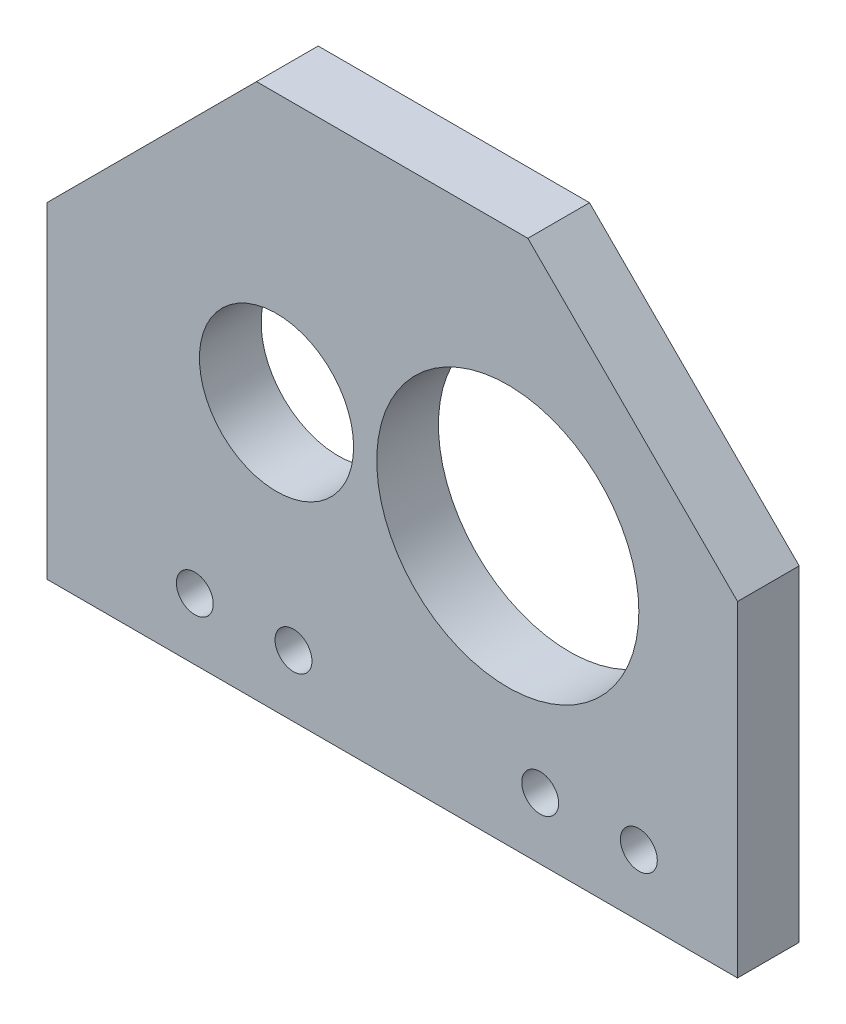
ISO-10303-21;
HEADER;
FILE_DESCRIPTION(('STEP AP214'),'2;1');
FILE_NAME('part.step','',(''),(''),'','','');
FILE_SCHEMA(('AUTOMOTIVE_DESIGN { 1 0 10303 214 1 1 1 1 }'));
ENDSEC;
DATA;
#1=APPLICATION_CONTEXT('core data for automotive mechanical design processes');
#2=APPLICATION_PROTOCOL_DEFINITION('international standard','automotive_design',2000,#1);
#3=PRODUCT_CONTEXT('',#1,'mechanical');
#4=PRODUCT('Part','Part','',(#3));
#5=PRODUCT_RELATED_PRODUCT_CATEGORY('part','',(#4));
#6=PRODUCT_DEFINITION_FORMATION('','',#4);
#7=PRODUCT_DEFINITION_CONTEXT('part definition',#1,'design');
#8=PRODUCT_DEFINITION('design','',#6,#7);
#9=PRODUCT_DEFINITION_SHAPE('','',#8);
#10=(LENGTH_UNIT() NAMED_UNIT(*) SI_UNIT(.MILLI.,.METRE.));
#11=(NAMED_UNIT(*) PLANE_ANGLE_UNIT() SI_UNIT($,.RADIAN.));
#12=(NAMED_UNIT(*) SI_UNIT($,.STERADIAN.) SOLID_ANGLE_UNIT());
#13=UNCERTAINTY_MEASURE_WITH_UNIT(LENGTH_MEASURE(1.E-05),#10,'distance_accuracy_value','');
#14=(GEOMETRIC_REPRESENTATION_CONTEXT(3) GLOBAL_UNCERTAINTY_ASSIGNED_CONTEXT((#13)) GLOBAL_UNIT_ASSIGNED_CONTEXT((#10,
#11,#12)) REPRESENTATION_CONTEXT('',''));
#15=CARTESIAN_POINT('',(0.,0.,0.));
#16=DIRECTION('',(0.,0.,1.));
#17=DIRECTION('',(1.,0.,0.));
#18=AXIS2_PLACEMENT_3D('',#15,#16,#17);
#19=CARTESIAN_POINT('',(0.,0.,6.35));
#20=DIRECTION('',(0.,0.,1.));
#21=DIRECTION('',(1.,0.,0.));
#22=AXIS2_PLACEMENT_3D('',#19,#20,#21);
#23=PLANE('',#22);
#24=DIRECTION('',(0.707106781186548,-0.707106781186548,0.));
#25=VECTOR('',#24,1.);
#26=CARTESIAN_POINT('',(35.56,5.99186000000002,6.35));
#27=LINE('',#26,#25);
#28=CARTESIAN_POINT('',(13.97,27.58186,6.35));
#29=VERTEX_POINT('',#28);
#30=CARTESIAN_POINT('',(35.56,5.99186000000002,6.35));
#31=VERTEX_POINT('',#30);
#32=EDGE_CURVE('E88',#29,#31,#27,.T.);
#33=ORIENTED_EDGE('',*,*,#32,.F.);
#34=DIRECTION('',(-1.,0.,0.));
#35=VECTOR('',#34,1.);
#36=CARTESIAN_POINT('',(35.56,27.58186,6.35));
#37=LINE('',#36,#35);
#38=CARTESIAN_POINT('',(-13.97,27.58186,6.35));
#39=VERTEX_POINT('',#38);
#40=EDGE_CURVE('E56',#29,#39,#37,.T.);
#41=ORIENTED_EDGE('',*,*,#40,.T.);
#42=DIRECTION('',(0.707106781186547,0.707106781186548,0.));
#43=VECTOR('',#42,1.);
#44=CARTESIAN_POINT('',(-35.56,5.99186000000001,6.35));
#45=LINE('',#44,#43);
#46=CARTESIAN_POINT('',(-35.56,5.99186000000001,6.35));
#47=VERTEX_POINT('',#46);
#48=EDGE_CURVE('E93',#47,#39,#45,.T.);
#49=ORIENTED_EDGE('',*,*,#48,.F.);
#50=DIRECTION('',(0.,-1.,0.));
#51=VECTOR('',#50,1.);
#52=CARTESIAN_POINT('',(-35.56,-27.58186,6.35));
#53=LINE('',#52,#51);
#54=CARTESIAN_POINT('',(-35.56,-27.58186,6.35));
#55=VERTEX_POINT('',#54);
#56=EDGE_CURVE('E111',#47,#55,#53,.T.);
#57=ORIENTED_EDGE('',*,*,#56,.T.);
#58=DIRECTION('',(1.,0.,0.));
#59=VECTOR('',#58,1.);
#60=CARTESIAN_POINT('',(35.56,-27.58186,6.35));
#61=LINE('',#60,#59);
#62=CARTESIAN_POINT('',(35.56,-27.58186,6.35));
#63=VERTEX_POINT('',#62);
#64=EDGE_CURVE('E118',#55,#63,#61,.T.);
#65=ORIENTED_EDGE('',*,*,#64,.T.);
#66=DIRECTION('',(0.,1.,0.));
#67=VECTOR('',#66,1.);
#68=CARTESIAN_POINT('',(35.56,-27.58186,6.35));
#69=LINE('',#68,#67);
#70=EDGE_CURVE('E116',#63,#31,#69,.T.);
#71=ORIENTED_EDGE('',*,*,#70,.T.);
#72=EDGE_LOOP('',(#33,#41,#49,#57,#65,#71));
#73=FACE_BOUND('',#72,.T.);
#74=CARTESIAN_POINT('',(-20.32,-21.23186,6.35));
#75=DIRECTION('',(0.,0.,1.));
#76=DIRECTION('',(1.,0.,0.));
#77=AXIS2_PLACEMENT_3D('',#74,#75,#76);
#78=CIRCLE('',#77,1.89864999999999);
#79=CARTESIAN_POINT('',(-18.42135,-21.23186,6.35));
#80=VERTEX_POINT('',#79);
#81=EDGE_CURVE('E154',#80,#80,#78,.T.);
#82=ORIENTED_EDGE('',*,*,#81,.F.);
#83=EDGE_LOOP('',(#82));
#84=FACE_BOUND('',#83,.T.);
#85=CARTESIAN_POINT('',(-10.16,-21.23186,6.35));
#86=DIRECTION('',(0.,0.,1.));
#87=DIRECTION('',(1.,0.,0.));
#88=AXIS2_PLACEMENT_3D('',#85,#86,#87);
#89=CIRCLE('',#88,1.89864999999999);
#90=CARTESIAN_POINT('',(-8.26135000000002,-21.23186,6.35));
#91=VERTEX_POINT('',#90);
#92=EDGE_CURVE('E161',#91,#91,#89,.T.);
#93=ORIENTED_EDGE('',*,*,#92,.F.);
#94=EDGE_LOOP('',(#93));
#95=FACE_BOUND('',#94,.T.);
#96=CARTESIAN_POINT('',(15.24,-21.23186,6.35));
#97=DIRECTION('',(0.,0.,1.));
#98=DIRECTION('',(1.,0.,0.));
#99=AXIS2_PLACEMENT_3D('',#96,#97,#98);
#100=CIRCLE('',#99,1.89864999999999);
#101=CARTESIAN_POINT('',(17.13865,-21.23186,6.35));
#102=VERTEX_POINT('',#101);
#103=EDGE_CURVE('E167',#102,#102,#100,.T.);
#104=ORIENTED_EDGE('',*,*,#103,.F.);
#105=EDGE_LOOP('',(#104));
#106=FACE_BOUND('',#105,.T.);
#107=CARTESIAN_POINT('',(25.4,-21.23186,6.35));
#108=DIRECTION('',(0.,0.,1.));
#109=DIRECTION('',(1.,0.,0.));
#110=AXIS2_PLACEMENT_3D('',#107,#108,#109);
#111=CIRCLE('',#110,1.89864999999999);
#112=CARTESIAN_POINT('',(27.29865,-21.23186,6.35));
#113=VERTEX_POINT('',#112);
#114=EDGE_CURVE('E173',#113,#113,#111,.T.);
#115=ORIENTED_EDGE('',*,*,#114,.F.);
#116=EDGE_LOOP('',(#115));
#117=FACE_BOUND('',#116,.T.);
#118=CARTESIAN_POINT('',(11.90625,0.,6.35));
#119=DIRECTION('',(0.,0.,1.));
#120=DIRECTION('',(1.,0.,0.));
#121=AXIS2_PLACEMENT_3D('',#118,#119,#120);
#122=CIRCLE('',#121,13.49375);
#123=CARTESIAN_POINT('',(25.4,0.,6.35));
#124=VERTEX_POINT('',#123);
#125=EDGE_CURVE('E121',#124,#124,#122,.T.);
#126=ORIENTED_EDGE('',*,*,#125,.F.);
#127=EDGE_LOOP('',(#126));
#128=FACE_BOUND('',#127,.T.);
#129=CARTESIAN_POINT('',(-11.90625,0.,6.35));
#130=DIRECTION('',(0.,0.,1.));
#131=DIRECTION('',(1.,0.,0.));
#132=AXIS2_PLACEMENT_3D('',#129,#130,#131);
#133=CIRCLE('',#132,7.9375);
#134=CARTESIAN_POINT('',(-3.96875,0.,6.35));
#135=VERTEX_POINT('',#134);
#136=EDGE_CURVE('E132',#135,#135,#133,.T.);
#137=ORIENTED_EDGE('',*,*,#136,.F.);
#138=EDGE_LOOP('',(#137));
#139=FACE_BOUND('',#138,.T.);
#140=ADVANCED_FACE('F33',(#73,#84,#95,#106,#117,#128,#139),#23,.T.);
#141=CARTESIAN_POINT('',(0.,0.,0.));
#142=DIRECTION('',(0.,0.,1.));
#143=DIRECTION('',(1.,0.,0.));
#144=AXIS2_PLACEMENT_3D('',#141,#142,#143);
#145=PLANE('',#144);
#146=CARTESIAN_POINT('',(-20.32,-21.23186,0.));
#147=DIRECTION('',(0.,0.,1.));
#148=DIRECTION('',(1.,0.,0.));
#149=AXIS2_PLACEMENT_3D('',#146,#147,#148);
#150=CIRCLE('',#149,1.89864999999999);
#151=CARTESIAN_POINT('',(-18.42135,-21.23186,0.));
#152=VERTEX_POINT('',#151);
#153=EDGE_CURVE('E158',#152,#152,#150,.T.);
#154=ORIENTED_EDGE('',*,*,#153,.T.);
#155=EDGE_LOOP('',(#154));
#156=FACE_BOUND('',#155,.T.);
#157=CARTESIAN_POINT('',(-10.16,-21.23186,0.));
#158=DIRECTION('',(0.,0.,1.));
#159=DIRECTION('',(1.,0.,0.));
#160=AXIS2_PLACEMENT_3D('',#157,#158,#159);
#161=CIRCLE('',#160,1.89864999999999);
#162=CARTESIAN_POINT('',(-8.26135000000002,-21.23186,0.));
#163=VERTEX_POINT('',#162);
#164=EDGE_CURVE('E164',#163,#163,#161,.T.);
#165=ORIENTED_EDGE('',*,*,#164,.T.);
#166=EDGE_LOOP('',(#165));
#167=FACE_BOUND('',#166,.T.);
#168=CARTESIAN_POINT('',(15.24,-21.23186,0.));
#169=DIRECTION('',(0.,0.,1.));
#170=DIRECTION('',(1.,0.,0.));
#171=AXIS2_PLACEMENT_3D('',#168,#169,#170);
#172=CIRCLE('',#171,1.89864999999999);
#173=CARTESIAN_POINT('',(17.13865,-21.23186,0.));
#174=VERTEX_POINT('',#173);
#175=EDGE_CURVE('E170',#174,#174,#172,.T.);
#176=ORIENTED_EDGE('',*,*,#175,.T.);
#177=EDGE_LOOP('',(#176));
#178=FACE_BOUND('',#177,.T.);
#179=CARTESIAN_POINT('',(25.4,-21.23186,0.));
#180=DIRECTION('',(0.,0.,1.));
#181=DIRECTION('',(1.,0.,0.));
#182=AXIS2_PLACEMENT_3D('',#179,#180,#181);
#183=CIRCLE('',#182,1.89864999999999);
#184=CARTESIAN_POINT('',(27.29865,-21.23186,0.));
#185=VERTEX_POINT('',#184);
#186=EDGE_CURVE('E176',#185,#185,#183,.T.);
#187=ORIENTED_EDGE('',*,*,#186,.T.);
#188=EDGE_LOOP('',(#187));
#189=FACE_BOUND('',#188,.T.);
#190=DIRECTION('',(-1.,0.,0.));
#191=VECTOR('',#190,1.);
#192=CARTESIAN_POINT('',(35.56,27.58186,0.));
#193=LINE('',#192,#191);
#194=CARTESIAN_POINT('',(13.97,27.58186,0.));
#195=VERTEX_POINT('',#194);
#196=CARTESIAN_POINT('',(-13.97,27.58186,0.));
#197=VERTEX_POINT('',#196);
#198=EDGE_CURVE('E104',#195,#197,#193,.T.);
#199=ORIENTED_EDGE('',*,*,#198,.F.);
#200=DIRECTION('',(0.707106781186548,-0.707106781186548,0.));
#201=VECTOR('',#200,1.);
#202=CARTESIAN_POINT('',(35.56,5.99186000000002,0.));
#203=LINE('',#202,#201);
#204=CARTESIAN_POINT('',(35.56,5.99186000000002,0.));
#205=VERTEX_POINT('',#204);
#206=EDGE_CURVE('E48',#195,#205,#203,.T.);
#207=ORIENTED_EDGE('',*,*,#206,.T.);
#208=DIRECTION('',(0.,1.,0.));
#209=VECTOR('',#208,1.);
#210=CARTESIAN_POINT('',(35.56,-27.58186,0.));
#211=LINE('',#210,#209);
#212=CARTESIAN_POINT('',(35.56,-27.58186,0.));
#213=VERTEX_POINT('',#212);
#214=EDGE_CURVE('E102',#213,#205,#211,.T.);
#215=ORIENTED_EDGE('',*,*,#214,.F.);
#216=DIRECTION('',(1.,0.,0.));
#217=VECTOR('',#216,1.);
#218=CARTESIAN_POINT('',(35.56,-27.58186,0.));
#219=LINE('',#218,#217);
#220=CARTESIAN_POINT('',(-35.56,-27.58186,0.));
#221=VERTEX_POINT('',#220);
#222=EDGE_CURVE('E109',#221,#213,#219,.T.);
#223=ORIENTED_EDGE('',*,*,#222,.F.);
#224=DIRECTION('',(0.,-1.,0.));
#225=VECTOR('',#224,1.);
#226=CARTESIAN_POINT('',(-35.56,-27.58186,0.));
#227=LINE('',#226,#225);
#228=CARTESIAN_POINT('',(-35.56,5.99186000000001,0.));
#229=VERTEX_POINT('',#228);
#230=EDGE_CURVE('E113',#229,#221,#227,.T.);
#231=ORIENTED_EDGE('',*,*,#230,.F.);
#232=DIRECTION('',(0.707106781186547,0.707106781186548,0.));
#233=VECTOR('',#232,1.);
#234=CARTESIAN_POINT('',(-35.56,5.99186000000001,0.));
#235=LINE('',#234,#233);
#236=EDGE_CURVE('E143',#229,#197,#235,.T.);
#237=ORIENTED_EDGE('',*,*,#236,.T.);
#238=EDGE_LOOP('',(#199,#207,#215,#223,#231,#237));
#239=FACE_BOUND('',#238,.T.);
#240=CARTESIAN_POINT('',(11.90625,0.,0.));
#241=DIRECTION('',(0.,0.,1.));
#242=DIRECTION('',(1.,0.,0.));
#243=AXIS2_PLACEMENT_3D('',#240,#241,#242);
#244=CIRCLE('',#243,13.49375);
#245=CARTESIAN_POINT('',(25.4,0.,0.));
#246=VERTEX_POINT('',#245);
#247=EDGE_CURVE('E127',#246,#246,#244,.T.);
#248=ORIENTED_EDGE('',*,*,#247,.T.);
#249=EDGE_LOOP('',(#248));
#250=FACE_BOUND('',#249,.T.);
#251=CARTESIAN_POINT('',(-11.90625,0.,0.));
#252=DIRECTION('',(0.,0.,1.));
#253=DIRECTION('',(1.,0.,0.));
#254=AXIS2_PLACEMENT_3D('',#251,#252,#253);
#255=CIRCLE('',#254,7.9375);
#256=CARTESIAN_POINT('',(-3.96875,0.,0.));
#257=VERTEX_POINT('',#256);
#258=EDGE_CURVE('E135',#257,#257,#255,.T.);
#259=ORIENTED_EDGE('',*,*,#258,.T.);
#260=EDGE_LOOP('',(#259));
#261=FACE_BOUND('',#260,.T.);
#262=ADVANCED_FACE('F99',(#156,#167,#178,#189,#239,#250,#261),#145,.F.);
#263=CARTESIAN_POINT('',(-35.56,-27.58186,6.35));
#264=DIRECTION('',(1.,0.,0.));
#265=DIRECTION('',(0.,0.,-1.));
#266=AXIS2_PLACEMENT_3D('',#263,#264,#265);
#267=PLANE('',#266);
#268=ORIENTED_EDGE('',*,*,#56,.F.);
#269=DIRECTION('',(0.,0.,1.));
#270=VECTOR('',#269,1.);
#271=CARTESIAN_POINT('',(-35.56,5.99186000000001,0.));
#272=LINE('',#271,#270);
#273=EDGE_CURVE('E146',#229,#47,#272,.T.);
#274=ORIENTED_EDGE('',*,*,#273,.F.);
#275=ORIENTED_EDGE('',*,*,#230,.T.);
#276=DIRECTION('',(0.,0.,-1.));
#277=VECTOR('',#276,1.);
#278=CARTESIAN_POINT('',(-35.56,-27.58186,6.35));
#279=LINE('',#278,#277);
#280=EDGE_CURVE('E11',#55,#221,#279,.T.);
#281=ORIENTED_EDGE('',*,*,#280,.F.);
#282=EDGE_LOOP('',(#268,#274,#275,#281));
#283=FACE_BOUND('',#282,.T.);
#284=ADVANCED_FACE('F35',(#283),#267,.F.);
#285=CARTESIAN_POINT('',(35.56,-27.58186,6.35));
#286=DIRECTION('',(0.,1.,0.));
#287=DIRECTION('',(-1.,0.,0.));
#288=AXIS2_PLACEMENT_3D('',#285,#286,#287);
#289=PLANE('',#288);
#290=ORIENTED_EDGE('',*,*,#222,.T.);
#291=DIRECTION('',(0.,0.,-1.));
#292=VECTOR('',#291,1.);
#293=CARTESIAN_POINT('',(35.56,-27.58186,6.35));
#294=LINE('',#293,#292);
#295=EDGE_CURVE('E41',#63,#213,#294,.T.);
#296=ORIENTED_EDGE('',*,*,#295,.F.);
#297=ORIENTED_EDGE('',*,*,#64,.F.);
#298=ORIENTED_EDGE('',*,*,#280,.T.);
#299=EDGE_LOOP('',(#290,#296,#297,#298));
#300=FACE_BOUND('',#299,.T.);
#301=ADVANCED_FACE('F142',(#300),#289,.F.);
#302=CARTESIAN_POINT('',(35.56,-27.58186,6.35));
#303=DIRECTION('',(-1.,0.,0.));
#304=DIRECTION('',(0.,0.,1.));
#305=AXIS2_PLACEMENT_3D('',#302,#303,#304);
#306=PLANE('',#305);
#307=ORIENTED_EDGE('',*,*,#214,.T.);
#308=DIRECTION('',(0.,0.,1.));
#309=VECTOR('',#308,1.);
#310=CARTESIAN_POINT('',(35.56,5.99186000000002,0.));
#311=LINE('',#310,#309);
#312=EDGE_CURVE('E86',#205,#31,#311,.T.);
#313=ORIENTED_EDGE('',*,*,#312,.T.);
#314=ORIENTED_EDGE('',*,*,#70,.F.);
#315=ORIENTED_EDGE('',*,*,#295,.T.);
#316=EDGE_LOOP('',(#307,#313,#314,#315));
#317=FACE_BOUND('',#316,.T.);
#318=ADVANCED_FACE('F107',(#317),#306,.F.);
#319=CARTESIAN_POINT('',(35.56,27.58186,6.35));
#320=DIRECTION('',(0.,-1.,0.));
#321=DIRECTION('',(1.,0.,0.));
#322=AXIS2_PLACEMENT_3D('',#319,#320,#321);
#323=PLANE('',#322);
#324=ORIENTED_EDGE('',*,*,#40,.F.);
#325=DIRECTION('',(0.,0.,1.));
#326=VECTOR('',#325,1.);
#327=CARTESIAN_POINT('',(13.97,27.58186,0.));
#328=LINE('',#327,#326);
#329=EDGE_CURVE('E94',#195,#29,#328,.T.);
#330=ORIENTED_EDGE('',*,*,#329,.F.);
#331=ORIENTED_EDGE('',*,*,#198,.T.);
#332=DIRECTION('',(0.,0.,1.));
#333=VECTOR('',#332,1.);
#334=CARTESIAN_POINT('',(-13.97,27.58186,0.));
#335=LINE('',#334,#333);
#336=EDGE_CURVE('E148',#197,#39,#335,.T.);
#337=ORIENTED_EDGE('',*,*,#336,.T.);
#338=EDGE_LOOP('',(#324,#330,#331,#337));
#339=FACE_BOUND('',#338,.T.);
#340=ADVANCED_FACE('F197',(#339),#323,.F.);
#341=CARTESIAN_POINT('',(11.90625,0.,6.35));
#342=DIRECTION('',(0.,0.,-1.));
#343=DIRECTION('',(-1.,0.,0.));
#344=AXIS2_PLACEMENT_3D('',#341,#342,#343);
#345=CYLINDRICAL_SURFACE('',#344,13.49375);
#346=ORIENTED_EDGE('',*,*,#125,.T.);
#347=EDGE_LOOP('',(#346));
#348=FACE_BOUND('',#347,.T.);
#349=ORIENTED_EDGE('',*,*,#247,.F.);
#350=EDGE_LOOP('',(#349));
#351=FACE_BOUND('',#350,.T.);
#352=ADVANCED_FACE('F188',(#348,#351),#345,.F.);
#353=CARTESIAN_POINT('',(-11.90625,0.,6.35));
#354=DIRECTION('',(0.,0.,-1.));
#355=DIRECTION('',(-1.,0.,0.));
#356=AXIS2_PLACEMENT_3D('',#353,#354,#355);
#357=CYLINDRICAL_SURFACE('',#356,7.9375);
#358=ORIENTED_EDGE('',*,*,#136,.T.);
#359=EDGE_LOOP('',(#358));
#360=FACE_BOUND('',#359,.T.);
#361=ORIENTED_EDGE('',*,*,#258,.F.);
#362=EDGE_LOOP('',(#361));
#363=FACE_BOUND('',#362,.T.);
#364=ADVANCED_FACE('F185',(#360,#363),#357,.F.);
#365=CARTESIAN_POINT('',(25.4,-21.23186,6.35));
#366=DIRECTION('',(0.,0.,1.));
#367=DIRECTION('',(1.,0.,0.));
#368=AXIS2_PLACEMENT_3D('',#365,#366,#367);
#369=CYLINDRICAL_SURFACE('',#368,1.89864999999999);
#370=ORIENTED_EDGE('',*,*,#186,.F.);
#371=EDGE_LOOP('',(#370));
#372=FACE_BOUND('',#371,.T.);
#373=ORIENTED_EDGE('',*,*,#114,.T.);
#374=EDGE_LOOP('',(#373));
#375=FACE_BOUND('',#374,.T.);
#376=ADVANCED_FACE('F187',(#372,#375),#369,.F.);
#377=CARTESIAN_POINT('',(15.24,-21.23186,6.35));
#378=DIRECTION('',(0.,0.,1.));
#379=DIRECTION('',(1.,0.,0.));
#380=AXIS2_PLACEMENT_3D('',#377,#378,#379);
#381=CYLINDRICAL_SURFACE('',#380,1.89864999999999);
#382=ORIENTED_EDGE('',*,*,#175,.F.);
#383=EDGE_LOOP('',(#382));
#384=FACE_BOUND('',#383,.T.);
#385=ORIENTED_EDGE('',*,*,#103,.T.);
#386=EDGE_LOOP('',(#385));
#387=FACE_BOUND('',#386,.T.);
#388=ADVANCED_FACE('F194',(#384,#387),#381,.F.);
#389=CARTESIAN_POINT('',(-10.16,-21.23186,6.35));
#390=DIRECTION('',(0.,0.,1.));
#391=DIRECTION('',(1.,0.,0.));
#392=AXIS2_PLACEMENT_3D('',#389,#390,#391);
#393=CYLINDRICAL_SURFACE('',#392,1.89864999999999);
#394=ORIENTED_EDGE('',*,*,#164,.F.);
#395=EDGE_LOOP('',(#394));
#396=FACE_BOUND('',#395,.T.);
#397=ORIENTED_EDGE('',*,*,#92,.T.);
#398=EDGE_LOOP('',(#397));
#399=FACE_BOUND('',#398,.T.);
#400=ADVANCED_FACE('F227',(#396,#399),#393,.F.);
#401=CARTESIAN_POINT('',(-20.32,-21.23186,6.35));
#402=DIRECTION('',(0.,0.,1.));
#403=DIRECTION('',(1.,0.,0.));
#404=AXIS2_PLACEMENT_3D('',#401,#402,#403);
#405=CYLINDRICAL_SURFACE('',#404,1.89864999999999);
#406=ORIENTED_EDGE('',*,*,#153,.F.);
#407=EDGE_LOOP('',(#406));
#408=FACE_BOUND('',#407,.T.);
#409=ORIENTED_EDGE('',*,*,#81,.T.);
#410=EDGE_LOOP('',(#409));
#411=FACE_BOUND('',#410,.T.);
#412=ADVANCED_FACE('F220',(#408,#411),#405,.F.);
#413=CARTESIAN_POINT('',(-35.56,5.99186000000001,0.));
#414=DIRECTION('',(0.707106781186548,-0.707106781186547,0.));
#415=DIRECTION('',(0.707106781186547,0.707106781186548,0.));
#416=AXIS2_PLACEMENT_3D('',#413,#414,#415);
#417=PLANE('',#416);
#418=ORIENTED_EDGE('',*,*,#48,.T.);
#419=ORIENTED_EDGE('',*,*,#336,.F.);
#420=ORIENTED_EDGE('',*,*,#236,.F.);
#421=ORIENTED_EDGE('',*,*,#273,.T.);
#422=EDGE_LOOP('',(#418,#419,#420,#421));
#423=FACE_BOUND('',#422,.T.);
#424=ADVANCED_FACE('F217',(#423),#417,.F.);
#425=CARTESIAN_POINT('',(35.56,5.99186000000002,0.));
#426=DIRECTION('',(-0.707106781186547,-0.707106781186548,0.));
#427=DIRECTION('',(0.707106781186548,-0.707106781186547,0.));
#428=AXIS2_PLACEMENT_3D('',#425,#426,#427);
#429=PLANE('',#428);
#430=ORIENTED_EDGE('',*,*,#32,.T.);
#431=ORIENTED_EDGE('',*,*,#312,.F.);
#432=ORIENTED_EDGE('',*,*,#206,.F.);
#433=ORIENTED_EDGE('',*,*,#329,.T.);
#434=EDGE_LOOP('',(#430,#431,#432,#433));
#435=FACE_BOUND('',#434,.T.);
#436=ADVANCED_FACE('F87',(#435),#429,.F.);
#437=CLOSED_SHELL('',(#140,#262,#284,#301,#318,#340,#352,#364,#376,#388,#400,#412,#424,#436));
#438=MANIFOLD_SOLID_BREP('B2',#437);
#439=ADVANCED_BREP_SHAPE_REPRESENTATION('',(#18,#438),#14);
#440=SHAPE_DEFINITION_REPRESENTATION(#9,#439);
ENDSEC;
END-ISO-10303-21;
